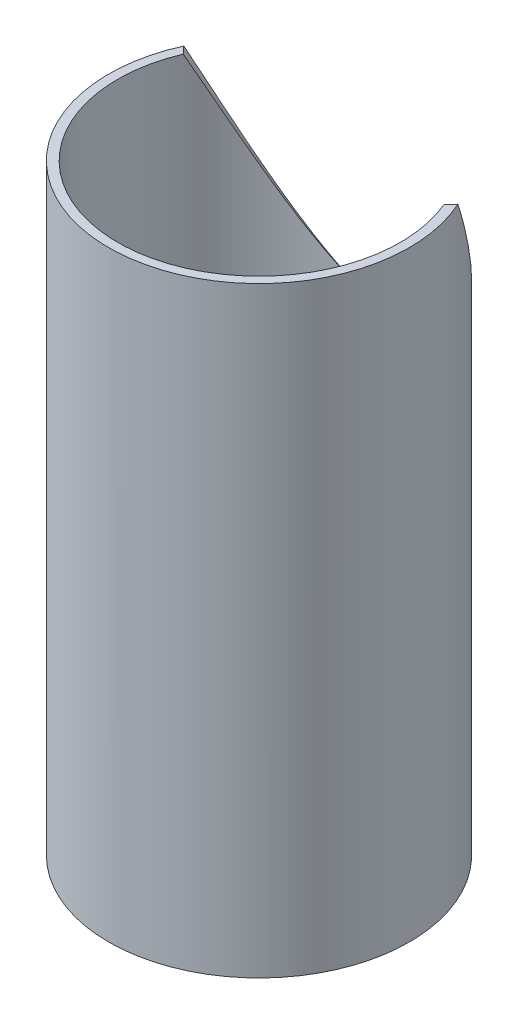
ISO-10303-21;
HEADER;
FILE_DESCRIPTION(('STEP AP214'),'2;1');
FILE_NAME('part.step','',(''),(''),'','','');
FILE_SCHEMA(('AUTOMOTIVE_DESIGN { 1 0 10303 214 1 1 1 1 }'));
ENDSEC;
DATA;
#1=APPLICATION_CONTEXT('core data for automotive mechanical design processes');
#2=APPLICATION_PROTOCOL_DEFINITION('international standard','automotive_design',2000,#1);
#3=PRODUCT_CONTEXT('',#1,'mechanical');
#4=PRODUCT('Part','Part','',(#3));
#5=PRODUCT_RELATED_PRODUCT_CATEGORY('part','',(#4));
#6=PRODUCT_DEFINITION_FORMATION('','',#4);
#7=PRODUCT_DEFINITION_CONTEXT('part definition',#1,'design');
#8=PRODUCT_DEFINITION('design','',#6,#7);
#9=PRODUCT_DEFINITION_SHAPE('','',#8);
#10=(LENGTH_UNIT() NAMED_UNIT(*) SI_UNIT(.MILLI.,.METRE.));
#11=(NAMED_UNIT(*) PLANE_ANGLE_UNIT() SI_UNIT($,.RADIAN.));
#12=(NAMED_UNIT(*) SI_UNIT($,.STERADIAN.) SOLID_ANGLE_UNIT());
#13=UNCERTAINTY_MEASURE_WITH_UNIT(LENGTH_MEASURE(1.E-05),#10,'distance_accuracy_value','');
#14=(GEOMETRIC_REPRESENTATION_CONTEXT(3) GLOBAL_UNCERTAINTY_ASSIGNED_CONTEXT((#13)) GLOBAL_UNIT_ASSIGNED_CONTEXT((#10,
#11,#12)) REPRESENTATION_CONTEXT('',''));
#15=CARTESIAN_POINT('',(0.,0.,0.));
#16=DIRECTION('',(0.,0.,1.));
#17=DIRECTION('',(1.,0.,0.));
#18=AXIS2_PLACEMENT_3D('',#15,#16,#17);
#19=CARTESIAN_POINT('',(0.,200.,0.));
#20=DIRECTION('',(0.,1.,0.));
#21=DIRECTION('',(0.,0.,1.00000000000001));
#22=AXIS2_PLACEMENT_3D('',#19,#20,#21);
#23=PLANE('',#22);
#24=CARTESIAN_POINT('',(0.,200.,-79.6979183351203));
#25=DIRECTION('',(0.,1.,0.));
#26=DIRECTION('',(0.,0.,-1.00000000000001));
#27=AXIS2_PLACEMENT_3D('',#24,#25,#26);
#28=ELLIPSE('',#27,81.1815101526369,66.5);
#29=CARTESIAN_POINT('',(-45.5706822778615,200.,-20.5745696608756));
#30=VERTEX_POINT('',#29);
#31=CARTESIAN_POINT('',(-43.3568691619068,200.,-18.1433705930656));
#32=VERTEX_POINT('',#31);
#33=EDGE_CURVE('E103',#30,#32,#28,.T.);
#34=ORIENTED_EDGE('',*,*,#33,.F.);
#35=CARTESIAN_POINT('',(0.,200.,0.));
#36=DIRECTION('',(0.,1.,0.));
#37=DIRECTION('',(0.,0.,1.00000000000001));
#38=AXIS2_PLACEMENT_3D('',#35,#36,#37);
#39=CIRCLE('',#38,50.);
#40=CARTESIAN_POINT('',(45.5706822778615,200.,-20.5745696608756));
#41=VERTEX_POINT('',#40);
#42=EDGE_CURVE('E99',#30,#41,#39,.T.);
#43=ORIENTED_EDGE('',*,*,#42,.T.);
#44=CARTESIAN_POINT('',(43.3568691619068,200.,-18.1433705930656));
#45=VERTEX_POINT('',#44);
#46=EDGE_CURVE('E114',#45,#41,#28,.T.);
#47=ORIENTED_EDGE('',*,*,#46,.F.);
#48=CARTESIAN_POINT('',(0.,200.,0.));
#49=DIRECTION('',(0.,1.,0.));
#50=DIRECTION('',(1.00000000000001,0.,0.));
#51=AXIS2_PLACEMENT_3D('',#48,#49,#50);
#52=CIRCLE('',#51,47.);
#53=EDGE_CURVE('E119',#32,#45,#52,.T.);
#54=ORIENTED_EDGE('',*,*,#53,.F.);
#55=EDGE_LOOP('',(#34,#43,#47,#54));
#56=FACE_BOUND('',#55,.T.);
#57=ADVANCED_FACE('F85',(#56),#23,.T.);
#58=CARTESIAN_POINT('',(0.,0.,0.));
#59=DIRECTION('',(0.,1.,0.));
#60=DIRECTION('',(0.,0.,1.00000000000001));
#61=AXIS2_PLACEMENT_3D('',#58,#59,#60);
#62=PLANE('',#61);
#63=CARTESIAN_POINT('',(0.,0.,0.));
#64=DIRECTION('',(0.,1.,0.));
#65=DIRECTION('',(0.,0.,1.00000000000001));
#66=AXIS2_PLACEMENT_3D('',#63,#64,#65);
#67=CIRCLE('',#66,50.);
#68=CARTESIAN_POINT('',(0.,0.,50.0000000000003));
#69=VERTEX_POINT('',#68);
#70=EDGE_CURVE('E124',#69,#69,#67,.T.);
#71=ORIENTED_EDGE('',*,*,#70,.F.);
#72=EDGE_LOOP('',(#71));
#73=FACE_BOUND('',#72,.T.);
#74=CARTESIAN_POINT('',(0.,0.,0.));
#75=DIRECTION('',(0.,1.,0.));
#76=DIRECTION('',(1.00000000000001,0.,0.));
#77=AXIS2_PLACEMENT_3D('',#74,#75,#76);
#78=CIRCLE('',#77,47.);
#79=CARTESIAN_POINT('',(47.0000000000003,0.,0.));
#80=VERTEX_POINT('',#79);
#81=EDGE_CURVE('E126',#80,#80,#78,.T.);
#82=ORIENTED_EDGE('',*,*,#81,.T.);
#83=EDGE_LOOP('',(#82));
#84=FACE_BOUND('',#83,.T.);
#85=ADVANCED_FACE('F143',(#73,#84),#62,.F.);
#86=CARTESIAN_POINT('',(0.,200.,0.));
#87=DIRECTION('',(0.,-1.,0.));
#88=DIRECTION('',(0.,0.,-1.00000000000001));
#89=AXIS2_PLACEMENT_3D('',#86,#87,#88);
#90=CYLINDRICAL_SURFACE('',#89,50.);
#91=ORIENTED_EDGE('',*,*,#42,.F.);
#92=CARTESIAN_POINT('',(-45.5706822778615,200.,-20.5745696608756));
#93=CARTESIAN_POINT('',(-45.374363840323,199.056999757363,-21.009361782318));
#94=CARTESIAN_POINT('',(-45.1722221405312,198.113542502961,-21.4405272167727));
#95=CARTESIAN_POINT('',(-44.7561734880295,196.226112459777,-22.2959982473499));
#96=CARTESIAN_POINT('',(-44.5422665402868,195.282139671214,-22.7203038463684));
#97=CARTESIAN_POINT('',(-44.102552914591,193.394009337184,-23.5624789546038));
#98=CARTESIAN_POINT('',(-43.876745394237,192.449851783364,-23.9803480054866));
#99=CARTESIAN_POINT('',(-43.4130424211094,190.561814252126,-24.8099475782849));
#100=CARTESIAN_POINT('',(-43.1751469590832,189.617934274921,-25.2216780955014));
#101=CARTESIAN_POINT('',(-42.4410084906317,186.779753568927,-26.4513799503976));
#102=CARTESIAN_POINT('',(-41.9260568836854,184.886422583885,-27.2605191061258));
#103=CARTESIAN_POINT('',(-40.8435443963132,181.105689481739,-28.8571528336935));
#104=CARTESIAN_POINT('',(-40.2759845094356,179.218287253362,-29.644647813936));
#105=CARTESIAN_POINT('',(-39.3586338998368,176.320285599453,-30.841150729999));
#106=CARTESIAN_POINT('',(-39.0289596229826,175.306280846055,-31.257407512517));
#107=CARTESIAN_POINT('',(-38.3522687380694,173.281694051883,-32.0840915014125));
#108=CARTESIAN_POINT('',(-38.005252400167,172.271111958053,-32.4945187984746));
#109=CARTESIAN_POINT('',(-37.2928922340391,170.253963117381,-33.3096559524896));
#110=CARTESIAN_POINT('',(-36.9275464117795,169.247396820325,-33.7143651812186));
#111=CARTESIAN_POINT('',(-36.1774566451753,167.239199002084,-34.5180210297533));
#112=CARTESIAN_POINT('',(-35.7927127780158,166.23756746128,-34.9169676724801));
#113=CARTESIAN_POINT('',(-35.0032530226007,164.241964730974,-35.7083197769778));
#114=CARTESIAN_POINT('',(-34.5985743796555,163.24798298881,-36.1007357320216));
#115=CARTESIAN_POINT('',(-33.7671124931639,161.266924569822,-36.8796236697348));
#116=CARTESIAN_POINT('',(-33.3403289108679,160.279847999082,-37.266095561196));
#117=CARTESIAN_POINT('',(-32.4630135263206,158.314098160868,-38.0327764363075));
#118=CARTESIAN_POINT('',(-32.0124865053319,157.335423247346,-38.4129866607952));
#119=CARTESIAN_POINT('',(-31.0855951817848,155.387875972773,-39.166856645403));
#120=CARTESIAN_POINT('',(-30.6092322023899,154.419003112728,-39.5405167396871));
#121=CARTESIAN_POINT('',(-29.6381347011033,152.512313355834,-40.2733600813052));
#122=CARTESIAN_POINT('',(-29.1439634781721,151.574264001401,-40.6326833273472));
#123=CARTESIAN_POINT('',(-28.1258412706059,149.711592592531,-41.3439564186334));
#124=CARTESIAN_POINT('',(-27.6018905250362,148.786970430378,-41.6959063230386));
#125=CARTESIAN_POINT('',(-26.5202926903921,146.952657190172,-42.3920790556415));
#126=CARTESIAN_POINT('',(-25.9625987609818,146.042989204845,-42.7362901887068));
#127=CARTESIAN_POINT('',(-24.8104580336544,144.243599277199,-43.415301228823));
#128=CARTESIAN_POINT('',(-24.2160127865527,143.353876495396,-43.7501015321217));
#129=CARTESIAN_POINT('',(-22.9966495582558,141.614458590285,-44.4029736286528));
#130=CARTESIAN_POINT('',(-22.3724469907297,140.76433544462,-44.7212356472033));
#131=CARTESIAN_POINT('',(-21.0790541234362,139.093706459261,-45.3452234322422));
#132=CARTESIAN_POINT('',(-20.4098538811018,138.27320722715,-45.6509464039517));
#133=CARTESIAN_POINT('',(-19.0225373151591,136.672250854723,-46.2462054966528));
#134=CARTESIAN_POINT('',(-18.3045519300044,135.89169567562,-46.5357814229411));
#135=CARTESIAN_POINT('',(-16.811891455112,134.379803177845,-47.0955990217112));
#136=CARTESIAN_POINT('',(-16.0372564019238,133.64843178752,-47.3658540869161));
#137=CARTESIAN_POINT('',(-14.7140925816483,132.501345766346,-47.7890074738199));
#138=CARTESIAN_POINT('',(-14.1843391412146,132.066641173938,-47.9491801522818));
#139=CARTESIAN_POINT('',(-13.0968027899874,131.228835542902,-48.2575727045177));
#140=CARTESIAN_POINT('',(-12.5390168953652,130.825737880318,-48.4057913014837));
#141=CARTESIAN_POINT('',(-11.3947428594561,130.057964822059,-48.6878498102833));
#142=CARTESIAN_POINT('',(-10.8082811475623,129.693254988161,-48.8217026120168));
#143=CARTESIAN_POINT('',(-9.60578901280586,129.009509797478,-49.0724531875134));
#144=CARTESIAN_POINT('',(-8.98976766692427,128.690460537877,-49.189356122346));
#145=CARTESIAN_POINT('',(-7.88093534765133,128.176965393041,-49.3773880872764));
#146=CARTESIAN_POINT('',(-7.39416898672874,127.971013949429,-49.4527612694683));
#147=CARTESIAN_POINT('',(-6.40532865015842,127.594416762847,-49.5905316129779));
#148=CARTESIAN_POINT('',(-5.90325637027434,127.423767124934,-49.6529302058205));
#149=CARTESIAN_POINT('',(-4.88619697634657,127.12182019369,-49.7633043682667));
#150=CARTESIAN_POINT('',(-4.37121972786695,126.990493776743,-49.811290612044));
#151=CARTESIAN_POINT('',(-3.33096244623842,126.770524718062,-49.8916501157057));
#152=CARTESIAN_POINT('',(-2.80568249243356,126.681881747744,-49.9240234957799));
#153=CARTESIAN_POINT('',(-1.74510246645774,126.549476053552,-49.9723746774177));
#154=CARTESIAN_POINT('',(-1.20975877070865,126.506019070932,-49.9882407865147));
#155=CARTESIAN_POINT('',(-0.137078638614962,126.466446179121,-50.0026889471031));
#156=CARTESIAN_POINT('',(0.400257790005382,126.470330086619,-50.0012710655209));
#157=CARTESIAN_POINT('',(1.47228328924595,126.525315645133,-49.9811953470214));
#158=CARTESIAN_POINT('',(2.00697173692528,126.576427921297,-49.9625336306924));
#159=CARTESIAN_POINT('',(3.06910443475891,126.724248443889,-49.9085505263441));
#160=CARTESIAN_POINT('',(3.59654872225932,126.820956455166,-49.8732292242439));
#161=CARTESIAN_POINT('',(4.59360582290411,127.046504379019,-49.7908242416816));
#162=CARTESIAN_POINT('',(5.06416543732341,127.171688223041,-49.7450782778248));
#163=CARTESIAN_POINT('',(5.99407977939521,127.454706073701,-49.6416170737099));
#164=CARTESIAN_POINT('',(6.45343053935478,127.612551459639,-49.5838976618777));
#165=CARTESIAN_POINT('',(7.81190769537692,128.130481862282,-49.3944226946));
#166=CARTESIAN_POINT('',(8.69205711438023,128.535102740133,-49.2462987263187));
#167=CARTESIAN_POINT('',(10.2898335508083,129.382616943763,-48.9356683722568));
#168=CARTESIAN_POINT('',(11.0141499596518,129.814719462464,-48.7771578990676));
#169=CARTESIAN_POINT('',(12.4197337185207,130.73723957158,-48.4383403279361));
#170=CARTESIAN_POINT('',(13.1009712303953,131.227696917752,-48.258018368941));
#171=CARTESIAN_POINT('',(14.4239248025198,132.256451562324,-47.8792798240755));
#172=CARTESIAN_POINT('',(15.0655198436936,132.794884172944,-47.6808120146445));
#173=CARTESIAN_POINT('',(16.3101623527381,133.909046008607,-47.2695253557571));
#174=CARTESIAN_POINT('',(16.9132156814467,134.484769536076,-47.0567086984182));
#175=CARTESIAN_POINT('',(18.0777327775482,135.659867838331,-46.6216429880873));
#176=CARTESIAN_POINT('',(18.6395834045616,136.258909772049,-46.399524613865));
#177=CARTESIAN_POINT('',(19.7321929707026,137.481290566505,-45.9455173637633));
#178=CARTESIAN_POINT('',(20.2629452262982,138.104634602561,-45.7136264058777));
#179=CARTESIAN_POINT('',(21.2965131588263,139.371837320075,-45.2413702622506));
#180=CARTESIAN_POINT('',(21.7993046837122,140.015713003786,-45.0009980346568));
#181=CARTESIAN_POINT('',(22.7789832989111,141.320118340433,-44.5131139284926));
#182=CARTESIAN_POINT('',(23.2558720354293,141.980646931106,-44.2656025051754));
#183=CARTESIAN_POINT('',(24.1890430836311,143.320085145552,-43.7626886330069));
#184=CARTESIAN_POINT('',(24.6451719597886,143.999086098967,-43.5072454642005));
#185=CARTESIAN_POINT('',(25.5355203292252,145.369172424466,-42.9907205315946));
#186=CARTESIAN_POINT('',(25.9697396922427,146.060257868366,-42.7296387342842));
#187=CARTESIAN_POINT('',(26.8178094308194,147.452394921407,-42.2025380755698));
#188=CARTESIAN_POINT('',(27.2316703099901,148.153441145633,-41.9365218596598));
#189=CARTESIAN_POINT('',(28.0408094899819,149.564426795995,-41.3998626118377));
#190=CARTESIAN_POINT('',(28.436087401263,150.27436640816,-41.1292194830972));
#191=CARTESIAN_POINT('',(29.3601352296277,151.980159104063,-40.4773414736682));
#192=CARTESIAN_POINT('',(29.8808862198638,152.979599375368,-40.0941170826612));
#193=CARTESIAN_POINT('',(30.8922713960432,154.990782856471,-39.3201342416321));
#194=CARTESIAN_POINT('',(31.3829031221874,156.002527063053,-38.9293751796792));
#195=CARTESIAN_POINT('',(32.3367734316407,158.036512278877,-38.1407410775073));
#196=CARTESIAN_POINT('',(32.8000034505032,159.058756453957,-37.7428638625782));
#197=CARTESIAN_POINT('',(33.7011066436555,161.111728254622,-36.9404833859814));
#198=CARTESIAN_POINT('',(34.1389804355356,162.142455672884,-36.5359802860055));
#199=CARTESIAN_POINT('',(34.9921999769453,164.213313139833,-35.7196762148016));
#200=CARTESIAN_POINT('',(35.4074940835679,165.253458878001,-35.3078611546491));
#201=CARTESIAN_POINT('',(36.2161270102345,167.339748896154,-34.4779318222351));
#202=CARTESIAN_POINT('',(36.6094656987868,168.385893212023,-34.0598175122661));
#203=CARTESIAN_POINT('',(37.3755064501202,170.483024696425,-33.2173992563878));
#204=CARTESIAN_POINT('',(37.7482115717738,171.534011121969,-32.7930962397853));
#205=CARTESIAN_POINT('',(38.4742116309577,173.640104720731,-31.9382114953838));
#206=CARTESIAN_POINT('',(38.8275066301513,174.695211880848,-31.507629787537));
#207=CARTESIAN_POINT('',(39.8271167329181,177.765128538077,-30.2475504965413));
#208=CARTESIAN_POINT('',(40.4492880804702,179.78439310908,-29.4096577522955));
#209=CARTESIAN_POINT('',(41.6324569717339,183.830567678731,-27.7094032446154));
#210=CARTESIAN_POINT('',(42.1934521371939,185.857477971443,-26.8470405315414));
#211=CARTESIAN_POINT('',(42.9904785830113,188.895181278052,-25.5358202121911));
#212=CARTESIAN_POINT('',(43.2481281803081,189.904674876052,-25.0969685825226));
#213=CARTESIAN_POINT('',(43.7495411549037,191.924073116232,-24.2123158397962));
#214=CARTESIAN_POINT('',(43.9933045424971,192.933977758106,-23.7665147318907));
#215=CARTESIAN_POINT('',(44.467180112216,194.953601593331,-22.8676214200027));
#216=CARTESIAN_POINT('',(44.6972938182136,195.963320794789,-22.414530037125));
#217=CARTESIAN_POINT('',(45.1440519201287,197.982200691117,-21.5005311142098));
#218=CARTESIAN_POINT('',(45.3606963185454,198.991361386091,-21.0396235756225));
#219=CARTESIAN_POINT('',(45.5706822778615,200.,-20.5745696608756));
#220=B_SPLINE_CURVE_WITH_KNOTS('',3,(#92,#93,#94,#95,#96,#97,#98,#99,#100,#101,#102,#103,#104,
#105,#106,#107,#108,#109,#110,#111,#112,#113,#114,#115,#116,#117,#118,#119,#120,#121,#122,#123,
#124,#125,#126,#127,#128,#129,#130,#131,#132,#133,#134,#135,#136,#137,#138,#139,#140,#141,#142,
#143,#144,#145,#146,#147,#148,#149,#150,#151,#152,#153,#154,#155,#156,#157,#158,#159,#160,#161,
#162,#163,#164,#165,#166,#167,#168,#169,#170,#171,#172,#173,#174,#175,#176,#177,#178,#179,#180,
#181,#182,#183,#184,#185,#186,#187,#188,#189,#190,#191,#192,#193,#194,#195,#196,#197,#198,#199,
#200,#201,#202,#203,#204,#205,#206,#207,#208,#209,#210,#211,#212,#213,#214,#215,#216,#217,#218,
#219),.UNSPECIFIED.,.F.,.F.,(4,2,2,2,2,2,2,2,2,2,2,2,2,2,2,2,2,2,2,2,2,2,2,2,2,2,2,2,2,2,2,2,2,
2,2,2,2,2,2,2,2,2,2,2,2,2,2,2,2,2,2,2,2,2,2,2,2,2,2,2,2,2,2,4),(0.,3.17038531832891,
6.34076929819311,9.51137800094124,12.6819891306686,19.0484144722384,25.4147196034148,
28.8484593316365,32.2821455853388,35.7162061975129,39.1502531466101,42.578110916277,
46.0060212320576,49.4332438809649,52.8602911734404,56.2183109876895,59.5763038480962,
62.9390700652357,66.3016944786291,69.6054669341897,72.9099717967191,76.2059333383456,
79.499587595868,81.6097058533842,83.7200491936538,85.8284828849025,87.9362732242633,
89.5365818512512,91.1367138176406,92.735657744129,94.3345893615297,95.9442707630694,
97.553945931646,99.1639833232046,100.774012411351,102.239761318728,103.706021756312,
106.636709170118,109.207735348619,111.780523245035,114.360812321623,116.940708088864,
119.492011118585,122.043860467559,124.597880878183,127.151738782234,129.722134352929,
132.292545203967,134.86161567922,137.430739983885,141.001220505962,144.571992237428,
148.143874185595,151.715669098394,155.295316395714,158.874985129329,162.454121757436,
166.033247014425,172.851165646252,179.669349233301,183.060789064672,186.452226381772,
189.84328435807,193.23434170519),.UNSPECIFIED.);
#221=EDGE_CURVE('E106',#30,#41,#220,.T.);
#222=ORIENTED_EDGE('',*,*,#221,.T.);
#223=EDGE_LOOP('',(#91,#222));
#224=FACE_BOUND('',#223,.T.);
#225=ORIENTED_EDGE('',*,*,#70,.T.);
#226=EDGE_LOOP('',(#225));
#227=FACE_BOUND('',#226,.T.);
#228=ADVANCED_FACE('F84',(#224,#227),#90,.T.);
#229=CARTESIAN_POINT('',(0.,200.,0.));
#230=DIRECTION('',(0.,-1.,0.));
#231=DIRECTION('',(0.,0.,-1.00000000000001));
#232=AXIS2_PLACEMENT_3D('',#229,#230,#231);
#233=CYLINDRICAL_SURFACE('',#232,47.);
#234=CARTESIAN_POINT('',(-43.3568691619068,200.,-18.1433705930656));
#235=CARTESIAN_POINT('',(-43.1707990159301,199.086095861504,-18.5879769127767));
#236=CARTESIAN_POINT('',(-42.9784018944178,198.171537351504,-19.0285805014316));
#237=CARTESIAN_POINT('',(-42.5808999625752,196.341562632266,-19.9022025081933));
#238=CARTESIAN_POINT('',(-42.3757951917518,195.426146425702,-20.3352209498763));
#239=CARTESIAN_POINT('',(-41.9528073673469,193.594833696762,-21.1941275932685));
#240=CARTESIAN_POINT('',(-41.7349233662812,192.678937143774,-21.6200152632675));
#241=CARTESIAN_POINT('',(-41.2862369916328,190.847173890975,-22.4649814229678));
#242=CARTESIAN_POINT('',(-41.0554345973936,189.931307191215,-22.8840599017799));
#243=CARTESIAN_POINT('',(-40.341298409322,187.176526070913,-24.1351467518522));
#244=CARTESIAN_POINT('',(-39.8380406465005,185.338269389707,-24.9573390188437));
#245=CARTESIAN_POINT('',(-38.7758739468167,181.667235915334,-26.5776241838998));
#246=CARTESIAN_POINT('',(-38.2169663214945,179.834458994071,-27.3757176493406));
#247=CARTESIAN_POINT('',(-37.3182846573738,177.044427628156,-28.5764346975593));
#248=CARTESIAN_POINT('',(-37.0001285027855,176.083718171136,-28.9872984124472));
#249=CARTESIAN_POINT('',(-36.3464491644399,174.165591933294,-29.8028329405441));
#250=CARTESIAN_POINT('',(-36.0109262878419,173.208175094556,-30.207503863119));
#251=CARTESIAN_POINT('',(-35.321554248927,171.297236988277,-31.0107713533428));
#252=CARTESIAN_POINT('',(-34.9677027816559,170.343716227043,-31.4093671488026));
#253=CARTESIAN_POINT('',(-34.2406323004142,168.441524726994,-32.2004304862197));
#254=CARTESIAN_POINT('',(-33.8674133794391,167.492853964916,-32.5928980575908));
#255=CARTESIAN_POINT('',(-33.1010420533496,165.603041474419,-33.3709251933942));
#256=CARTESIAN_POINT('',(-32.70792724898,164.661889169176,-33.7564960523986));
#257=CARTESIAN_POINT('',(-31.8996586144215,162.786464679375,-34.5213176860733));
#258=CARTESIAN_POINT('',(-31.4845043646799,161.852192626179,-34.9005683402487));
#259=CARTESIAN_POINT('',(-30.6305418796281,159.992109059533,-35.652397792138));
#260=CARTESIAN_POINT('',(-30.1917395159606,159.066295512062,-36.0249782156901));
#261=CARTESIAN_POINT('',(-29.28838299898,157.224552588889,-36.7631734685732));
#262=CARTESIAN_POINT('',(-28.8238305048588,156.30862258088,-37.1287887446635));
#263=CARTESIAN_POINT('',(-27.9607596422556,154.667705095889,-37.7813194665713));
#264=CARTESIAN_POINT('',(-27.5672394708636,153.940616471223,-38.0695618435188));
#265=CARTESIAN_POINT('',(-26.7605743691689,152.495339195294,-38.6408588525832));
#266=CARTESIAN_POINT('',(-26.3474298501972,151.777150357887,-38.9239135932619));
#267=CARTESIAN_POINT('',(-25.4995996107011,150.350764949231,-39.4845396257098));
#268=CARTESIAN_POINT('',(-25.0649013991771,149.642574485077,-39.7621076042917));
#269=CARTESIAN_POINT('',(-24.1722715180262,148.238493410988,-40.310989020823));
#270=CARTESIAN_POINT('',(-23.7143401129543,147.542602661119,-40.5823025299406));
#271=CARTESIAN_POINT('',(-22.7778739569308,146.172527375054,-41.115151906251));
#272=CARTESIAN_POINT('',(-22.2995998515638,145.498193128939,-41.3767596784652));
#273=CARTESIAN_POINT('',(-21.3156129960036,144.16660971996,-41.8921613442131));
#274=CARTESIAN_POINT('',(-20.8098979410039,143.509361999097,-42.1459545785772));
#275=CARTESIAN_POINT('',(-19.7688043896733,142.216296111297,-42.6441917678142));
#276=CARTESIAN_POINT('',(-19.2334578915253,141.580455976179,-42.8886453439523));
#277=CARTESIAN_POINT('',(-18.129567544625,140.334211967591,-43.3668143689753));
#278=CARTESIAN_POINT('',(-17.5610331833745,139.723800909326,-43.6005328529207));
#279=CARTESIAN_POINT('',(-16.5357607267483,138.684832946706,-43.9976071584195));
#280=CARTESIAN_POINT('',(-16.087143811287,138.249349084858,-44.1638007469605));
#281=CARTESIAN_POINT('',(-15.1678630747181,137.398992066017,-44.487902816037));
#282=CARTESIAN_POINT('',(-14.6972001755027,136.984118048679,-44.6458116424303));
#283=CARTESIAN_POINT('',(-13.7314882680968,136.178094040573,-44.9522333926502));
#284=CARTESIAN_POINT('',(-13.2363984385398,135.786986380533,-45.1007295705905));
#285=CARTESIAN_POINT('',(-12.2212302768817,135.03393949537,-45.3863365781599));
#286=CARTESIAN_POINT('',(-11.7011514001099,134.672000906488,-45.5234471594464));
#287=CARTESIAN_POINT('',(-10.6282691388786,133.978516810215,-45.7859008074271));
#288=CARTESIAN_POINT('',(-10.0751333256435,133.647417116327,-45.9110717557284));
#289=CARTESIAN_POINT('',(-8.94199876453439,133.027706572819,-46.1451539275828));
#290=CARTESIAN_POINT('',(-8.36199799246304,132.739098931721,-46.2540639233001));
#291=CARTESIAN_POINT('',(-7.17777651846246,132.212768570869,-46.4525453927731));
#292=CARTESIAN_POINT('',(-6.57362079655252,131.974918975866,-46.5421650896888));
#293=CARTESIAN_POINT('',(-5.34281072342954,131.557274237088,-46.6994493347192));
#294=CARTESIAN_POINT('',(-4.71616732990887,131.377451233989,-46.7671244188056));
#295=CARTESIAN_POINT('',(-3.61911723389993,131.123280035165,-46.8627484862474));
#296=CARTESIAN_POINT('',(-3.15274584990212,131.03353984197,-46.8964987117656));
#297=CARTESIAN_POINT('',(-2.21363644547396,130.890742371394,-46.9501951091524));
#298=CARTESIAN_POINT('',(-1.74089945706823,130.837679219036,-46.9701434918193));
#299=CARTESIAN_POINT('',(-0.792519801620565,130.769666550065,-46.9957108764648));
#300=CARTESIAN_POINT('',(-0.316878614105751,130.754699024658,-47.0013366491147));
#301=CARTESIAN_POINT('',(0.634028252537866,130.763234297592,-46.9981283286525));
#302=CARTESIAN_POINT('',(1.1092939160921,130.786738615522,-46.9892936643715));
#303=CARTESIAN_POINT('',(2.05509146430218,130.871499333008,-46.9574288210589));
#304=CARTESIAN_POINT('',(2.52563023889386,130.932688836415,-46.9344237962654));
#305=CARTESIAN_POINT('',(3.45966548860493,131.09115300764,-46.8748307314957));
#306=CARTESIAN_POINT('',(3.92316207047697,131.188427127881,-46.8382428976357));
#307=CARTESIAN_POINT('',(4.84079956010383,131.416788137304,-46.7523173990991));
#308=CARTESIAN_POINT('',(5.29493454069827,131.547895778147,-46.7029719095282));
#309=CARTESIAN_POINT('',(6.19177003873542,131.841127177422,-46.5925564831234));
#310=CARTESIAN_POINT('',(6.63446489057375,132.003265981816,-46.5314808586931));
#311=CARTESIAN_POINT('',(7.71051378618188,132.437735681428,-46.3677326576516));
#312=CARTESIAN_POINT('',(8.33646208143824,132.726184695315,-46.2589470720518));
#313=CARTESIAN_POINT('',(9.55856232669598,133.353912515206,-46.021972418678));
#314=CARTESIAN_POINT('',(10.1546967789536,133.693220714214,-45.8937721301359));
#315=CARTESIAN_POINT('',(11.3179448559588,134.414758187099,-45.6208478098599));
#316=CARTESIAN_POINT('',(11.8849979388587,134.797072098942,-45.4760911844841));
#317=CARTESIAN_POINT('',(12.9897320634646,135.596703221234,-45.1729452545715));
#318=CARTESIAN_POINT('',(13.5274167368711,136.014016087452,-45.0145576419115));
#319=CARTESIAN_POINT('',(14.5243521412616,136.835814725416,-44.7022250824343));
#320=CARTESIAN_POINT('',(14.9861548530064,137.237626044199,-44.5493364508459));
#321=CARTESIAN_POINT('',(15.8885734323163,138.061288194798,-44.2355223557667));
#322=CARTESIAN_POINT('',(16.3291901925719,138.483138180774,-44.0745972314847));
#323=CARTESIAN_POINT('',(17.1910047213981,139.344230285828,-43.7456540380667));
#324=CARTESIAN_POINT('',(17.6121868234176,139.783485923449,-43.5776304487509));
#325=CARTESIAN_POINT('',(18.4361425040144,140.676609186316,-43.2354904069326));
#326=CARTESIAN_POINT('',(18.8389159009006,141.130476955707,-43.0613738943239));
#327=CARTESIAN_POINT('',(19.6283684106372,142.051970837432,-42.7073152579414));
#328=CARTESIAN_POINT('',(20.0150031209809,142.519629549614,-42.5273592093665));
#329=CARTESIAN_POINT('',(20.772271321545,143.465865385738,-42.1626534459438));
#330=CARTESIAN_POINT('',(21.142905045064,143.944442350333,-41.9779038010508));
#331=CARTESIAN_POINT('',(21.8691431718907,144.91091315942,-41.6041738723923));
#332=CARTESIAN_POINT('',(22.224753355931,145.39880331353,-41.4151952594566));
#333=CARTESIAN_POINT('',(22.9221050525121,146.38290158411,-41.0333412700633));
#334=CARTESIAN_POINT('',(23.263846143562,146.87910995273,-40.8404657754432));
#335=CARTESIAN_POINT('',(24.0841811253454,148.102191127281,-40.3641795311912));
#336=CARTESIAN_POINT('',(24.5556945008001,148.833060939702,-40.0788235908474));
#337=CARTESIAN_POINT('',(25.4740547938839,150.307621784713,-39.5014766442781));
#338=CARTESIAN_POINT('',(25.9208991662909,151.051314129918,-39.2094849577812));
#339=CARTESIAN_POINT('',(26.7921388140833,152.549761520731,-38.6194018832089));
#340=CARTESIAN_POINT('',(27.2165252639126,153.304520768799,-38.3213081600325));
#341=CARTESIAN_POINT('',(28.0444557929293,154.823168458493,-37.7196280035842));
#342=CARTESIAN_POINT('',(28.4480005061764,155.587056621521,-37.4160417377895));
#343=CARTESIAN_POINT('',(29.2365200719663,157.124003427728,-36.8032016319953));
#344=CARTESIAN_POINT('',(29.6214610344828,157.897075830802,-36.4939387673365));
#345=CARTESIAN_POINT('',(30.3733802752453,159.44995901497,-35.8705484914119));
#346=CARTESIAN_POINT('',(30.7403584267626,160.229769843558,-35.5564210458467));
#347=CARTESIAN_POINT('',(31.4574695358719,161.795033855226,-34.9235775125102));
#348=CARTESIAN_POINT('',(31.8076058039727,162.580485894273,-34.6048623426553));
#349=CARTESIAN_POINT('',(32.4921450709047,164.15639894107,-33.9629292028207));
#350=CARTESIAN_POINT('',(32.8265476738058,164.946860074305,-33.6397111197925));
#351=CARTESIAN_POINT('',(33.8095876504031,167.32965406615,-32.661433806288));
#352=CARTESIAN_POINT('',(34.435843168803,168.928530790261,-31.9997169403694));
#353=CARTESIAN_POINT('',(35.6347785015741,172.139022633807,-30.6589454993303));
#354=CARTESIAN_POINT('',(36.207455814202,173.750638344261,-29.9798901164997));
#355=CARTESIAN_POINT('',(37.3032420003171,176.981399927177,-28.6048972237897));
#356=CARTESIAN_POINT('',(37.826399182115,178.600536810174,-27.9089770163205));
#357=CARTESIAN_POINT('',(38.8272080996271,181.844817842508,-26.4989680900868));
#358=CARTESIAN_POINT('',(39.3048623240232,183.469961658254,-25.7848803676634));
#359=CARTESIAN_POINT('',(40.1101580636097,186.341939881841,-24.50721647813));
#360=CARTESIAN_POINT('',(40.4467011931068,187.588068714115,-23.9476382224839));
#361=CARTESIAN_POINT('',(41.095420168334,190.081272385152,-22.81647669356));
#362=CARTESIAN_POINT('',(41.4075952515994,191.328347252285,-22.2448930453486));
#363=CARTESIAN_POINT('',(42.0060413320379,193.813715124592,-21.0929109130587));
#364=CARTESIAN_POINT('',(42.2924760802423,195.052009399923,-20.5126003681768));
#365=CARTESIAN_POINT('',(42.7046916400168,196.908456584138,-19.6319714117097));
#366=CARTESIAN_POINT('',(42.839189363896,197.52709987966,-19.3367378382511));
#367=CARTESIAN_POINT('',(43.1023808068287,198.763927911097,-18.7427384789216));
#368=CARTESIAN_POINT('',(43.2310745045734,199.382112645321,-18.4439726800879));
#369=CARTESIAN_POINT('',(43.3568691619068,200.,-18.1433705930656));
#370=B_SPLINE_CURVE_WITH_KNOTS('',3,(#234,#235,#236,#237,#238,#239,#240,#241,#242,#243,#244,
#245,#246,#247,#248,#249,#250,#251,#252,#253,#254,#255,#256,#257,#258,#259,#260,#261,#262,#263,
#264,#265,#266,#267,#268,#269,#270,#271,#272,#273,#274,#275,#276,#277,#278,#279,#280,#281,#282,
#283,#284,#285,#286,#287,#288,#289,#290,#291,#292,#293,#294,#295,#296,#297,#298,#299,#300,#301,
#302,#303,#304,#305,#306,#307,#308,#309,#310,#311,#312,#313,#314,#315,#316,#317,#318,#319,#320,
#321,#322,#323,#324,#325,#326,#327,#328,#329,#330,#331,#332,#333,#334,#335,#336,#337,#338,#339,
#340,#341,#342,#343,#344,#345,#346,#347,#348,#349,#350,#351,#352,#353,#354,#355,#356,#357,#358,
#359,#360,#361,#362,#363,#364,#365,#366,#367,#368,#369),.UNSPECIFIED.,.F.,.F.,(4,2,2,2,2,2,2,2,
2,2,2,2,2,2,2,2,2,2,2,2,2,2,2,2,2,2,2,2,2,2,2,2,2,2,2,2,2,2,2,2,2,2,2,2,2,2,2,2,2,2,2,2,2,2,2,2,
2,2,2,2,2,2,2,2,2,2,2,4),(0.,3.0995883730975,6.19916711034695,9.2989759493608,12.398789745073,
18.6249292813272,24.8509221163993,28.1275169696667,31.4040538906961,34.6810038653267,
37.9579381067072,41.2288951616711,44.499914506371,47.7701253910335,51.0401258063055,
53.666548615984,56.2929163994746,58.9208244477884,61.5487025789716,64.1495267615427,
66.7505697303938,69.3488567180851,71.9464045300097,73.8865613246141,75.8266370603857,
77.7700727116139,79.7135507419352,81.6817818266562,83.650161453937,85.6135617280931,
87.576017940737,89.0028837881242,90.4295210252235,91.8554837283659,93.2815027565852,
94.7049976811231,96.1284710053168,97.5528194952441,98.9778603613101,101.067734129719,
103.15882038743,105.254096517853,107.349112956872,109.241153297626,111.133113845447,
113.026573797235,114.920052433161,116.818436893698,118.716793665946,120.614413212201,
122.512090385251,125.257700277286,128.003592920001,130.750556755138,133.497436971223,
136.249145794654,139.000874028763,141.752059142984,144.503313452427,150.022901568916,
155.542747284706,161.057151505581,166.57125395516,170.791551917894,175.011981878897,
179.203315203033,181.298936249141,183.394564988413),.UNSPECIFIED.);
#371=EDGE_CURVE('E60',#32,#45,#370,.T.);
#372=ORIENTED_EDGE('',*,*,#371,.F.);
#373=ORIENTED_EDGE('',*,*,#53,.T.);
#374=EDGE_LOOP('',(#372,#373));
#375=FACE_BOUND('',#374,.T.);
#376=ORIENTED_EDGE('',*,*,#81,.F.);
#377=EDGE_LOOP('',(#376));
#378=FACE_BOUND('',#377,.T.);
#379=ADVANCED_FACE('F123',(#375,#378),#233,.F.);
#380=CARTESIAN_POINT('',(0.,260.938088395403,-37.0286094765693));
#381=DIRECTION('',(0.,-0.819152044288991,-0.57357643635105));
#382=DIRECTION('',(0.,0.573576436351047,-0.819152044288997));
#383=AXIS2_PLACEMENT_3D('',#380,#381,#382);
#384=CYLINDRICAL_SURFACE('',#383,66.5);
#385=ORIENTED_EDGE('',*,*,#33,.T.);
#386=ORIENTED_EDGE('',*,*,#371,.T.);
#387=ORIENTED_EDGE('',*,*,#46,.T.);
#388=ORIENTED_EDGE('',*,*,#221,.F.);
#389=EDGE_LOOP('',(#385,#386,#387,#388));
#390=FACE_BOUND('',#389,.T.);
#391=ADVANCED_FACE('F111',(#390),#384,.F.);
#392=CLOSED_SHELL('',(#57,#85,#228,#379,#391));
#393=MANIFOLD_SOLID_BREP('B7',#392);
#394=ADVANCED_BREP_SHAPE_REPRESENTATION('',(#18,#393),#14);
#395=SHAPE_DEFINITION_REPRESENTATION(#9,#394);
ENDSEC;
END-ISO-10303-21;
